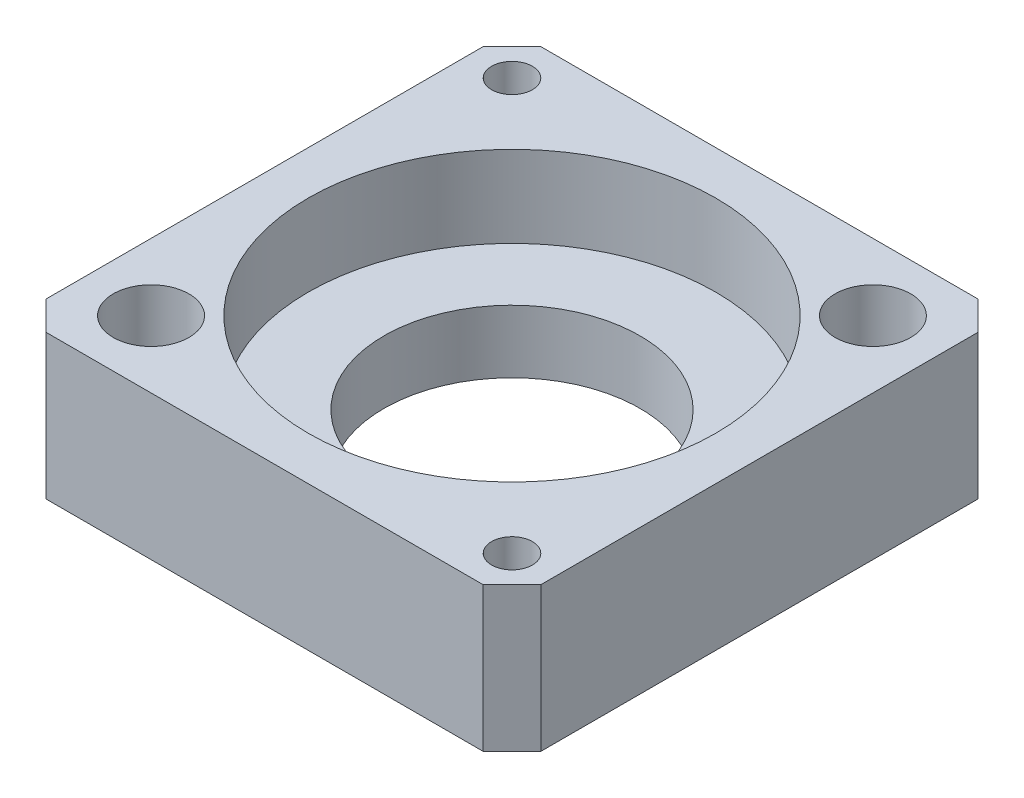
ISO-10303-21;
HEADER;
FILE_DESCRIPTION(('STEP AP214'),'2;1');
FILE_NAME('part.step','',(''),(''),'','','');
FILE_SCHEMA(('AUTOMOTIVE_DESIGN { 1 0 10303 214 1 1 1 1 }'));
ENDSEC;
DATA;
#1=APPLICATION_CONTEXT('core data for automotive mechanical design processes');
#2=APPLICATION_PROTOCOL_DEFINITION('international standard','automotive_design',2000,#1);
#3=PRODUCT_CONTEXT('',#1,'mechanical');
#4=PRODUCT('Part','Part','',(#3));
#5=PRODUCT_RELATED_PRODUCT_CATEGORY('part','',(#4));
#6=PRODUCT_DEFINITION_FORMATION('','',#4);
#7=PRODUCT_DEFINITION_CONTEXT('part definition',#1,'design');
#8=PRODUCT_DEFINITION('design','',#6,#7);
#9=PRODUCT_DEFINITION_SHAPE('','',#8);
#10=(LENGTH_UNIT() NAMED_UNIT(*) SI_UNIT(.MILLI.,.METRE.));
#11=(NAMED_UNIT(*) PLANE_ANGLE_UNIT() SI_UNIT($,.RADIAN.));
#12=(NAMED_UNIT(*) SI_UNIT($,.STERADIAN.) SOLID_ANGLE_UNIT());
#13=UNCERTAINTY_MEASURE_WITH_UNIT(LENGTH_MEASURE(1.E-05),#10,'distance_accuracy_value','');
#14=(GEOMETRIC_REPRESENTATION_CONTEXT(3) GLOBAL_UNCERTAINTY_ASSIGNED_CONTEXT((#13)) GLOBAL_UNIT_ASSIGNED_CONTEXT((#10,
#11,#12)) REPRESENTATION_CONTEXT('',''));
#15=CARTESIAN_POINT('',(0.,0.,0.));
#16=DIRECTION('',(0.,0.,1.));
#17=DIRECTION('',(1.,0.,0.));
#18=AXIS2_PLACEMENT_3D('',#15,#16,#17);
#19=CARTESIAN_POINT('',(0.,12.4,0.));
#20=DIRECTION('',(0.,0.,-1.));
#21=DIRECTION('',(-1.,0.,0.));
#22=AXIS2_PLACEMENT_3D('',#19,#20,#21);
#23=PLANE('',#22);
#24=DIRECTION('',(1.,0.,0.));
#25=VECTOR('',#24,1.);
#26=CARTESIAN_POINT('',(0.,0.,0.));
#27=LINE('',#26,#25);
#28=CARTESIAN_POINT('',(2.47487373415292,0.,0.));
#29=VERTEX_POINT('',#28);
#30=CARTESIAN_POINT('',(40.0251262658471,0.,0.));
#31=VERTEX_POINT('',#30);
#32=EDGE_CURVE('E139',#29,#31,#27,.T.);
#33=ORIENTED_EDGE('',*,*,#32,.T.);
#34=DIRECTION('',(0.,-1.,0.));
#35=VECTOR('',#34,1.);
#36=CARTESIAN_POINT('',(40.0251262658471,12.4,0.));
#37=LINE('',#36,#35);
#38=CARTESIAN_POINT('',(40.0251262658471,12.4,0.));
#39=VERTEX_POINT('',#38);
#40=EDGE_CURVE('E11',#39,#31,#37,.T.);
#41=ORIENTED_EDGE('',*,*,#40,.F.);
#42=DIRECTION('',(1.,0.,0.));
#43=VECTOR('',#42,1.);
#44=CARTESIAN_POINT('',(0.,12.4,0.));
#45=LINE('',#44,#43);
#46=CARTESIAN_POINT('',(2.47487373415292,12.4,0.));
#47=VERTEX_POINT('',#46);
#48=EDGE_CURVE('E157',#47,#39,#45,.T.);
#49=ORIENTED_EDGE('',*,*,#48,.F.);
#50=DIRECTION('',(0.,-1.,0.));
#51=VECTOR('',#50,1.);
#52=CARTESIAN_POINT('',(2.47487373415292,12.4,0.));
#53=LINE('',#52,#51);
#54=EDGE_CURVE('E135',#47,#29,#53,.T.);
#55=ORIENTED_EDGE('',*,*,#54,.T.);
#56=EDGE_LOOP('',(#33,#41,#49,#55));
#57=FACE_BOUND('',#56,.T.);
#58=ADVANCED_FACE('F43',(#57),#23,.F.);
#59=CARTESIAN_POINT('',(20.0125631329231,12.4,20.0125631329235));
#60=DIRECTION('',(-0.70710678118654,0.,-0.707106781186555));
#61=DIRECTION('',(-0.707106781186555,0.,0.70710678118654));
#62=AXIS2_PLACEMENT_3D('',#59,#60,#61);
#63=PLANE('',#62);
#64=DIRECTION('',(0.707106781186555,0.,-0.70710678118654));
#65=VECTOR('',#64,1.);
#66=CARTESIAN_POINT('',(20.0125631329231,0.,20.0125631329235));
#67=LINE('',#66,#65);
#68=CARTESIAN_POINT('',(42.5,0.,-2.47487373415289));
#69=VERTEX_POINT('',#68);
#70=EDGE_CURVE('E142',#31,#69,#67,.T.);
#71=ORIENTED_EDGE('',*,*,#70,.T.);
#72=DIRECTION('',(0.,-1.,0.));
#73=VECTOR('',#72,1.);
#74=CARTESIAN_POINT('',(42.5,12.4,-2.47487373415289));
#75=LINE('',#74,#73);
#76=CARTESIAN_POINT('',(42.5,12.4,-2.47487373415289));
#77=VERTEX_POINT('',#76);
#78=EDGE_CURVE('E52',#77,#69,#75,.T.);
#79=ORIENTED_EDGE('',*,*,#78,.F.);
#80=DIRECTION('',(0.707106781186555,0.,-0.70710678118654));
#81=VECTOR('',#80,1.);
#82=CARTESIAN_POINT('',(20.0125631329231,12.4,20.0125631329235));
#83=LINE('',#82,#81);
#84=EDGE_CURVE('E100',#39,#77,#83,.T.);
#85=ORIENTED_EDGE('',*,*,#84,.F.);
#86=ORIENTED_EDGE('',*,*,#40,.T.);
#87=EDGE_LOOP('',(#71,#79,#85,#86));
#88=FACE_BOUND('',#87,.T.);
#89=ADVANCED_FACE('F238',(#88),#63,.F.);
#90=CARTESIAN_POINT('',(42.5,12.4,0.));
#91=DIRECTION('',(-1.,0.,0.));
#92=DIRECTION('',(0.,0.,1.));
#93=AXIS2_PLACEMENT_3D('',#90,#91,#92);
#94=PLANE('',#93);
#95=DIRECTION('',(0.,0.,-1.));
#96=VECTOR('',#95,1.);
#97=CARTESIAN_POINT('',(42.5,0.,0.));
#98=LINE('',#97,#96);
#99=CARTESIAN_POINT('',(42.5,0.,-40.0251262658471));
#100=VERTEX_POINT('',#99);
#101=EDGE_CURVE('E145',#69,#100,#98,.T.);
#102=ORIENTED_EDGE('',*,*,#101,.T.);
#103=DIRECTION('',(0.,-1.,0.));
#104=VECTOR('',#103,1.);
#105=CARTESIAN_POINT('',(42.5,12.4,-40.0251262658471));
#106=LINE('',#105,#104);
#107=CARTESIAN_POINT('',(42.5,12.4,-40.0251262658471));
#108=VERTEX_POINT('',#107);
#109=EDGE_CURVE('E163',#108,#100,#106,.T.);
#110=ORIENTED_EDGE('',*,*,#109,.F.);
#111=DIRECTION('',(0.,0.,-1.));
#112=VECTOR('',#111,1.);
#113=CARTESIAN_POINT('',(42.5,12.4,0.));
#114=LINE('',#113,#112);
#115=EDGE_CURVE('E210',#77,#108,#114,.T.);
#116=ORIENTED_EDGE('',*,*,#115,.F.);
#117=ORIENTED_EDGE('',*,*,#78,.T.);
#118=EDGE_LOOP('',(#102,#110,#116,#117));
#119=FACE_BOUND('',#118,.T.);
#120=ADVANCED_FACE('F242',(#119),#94,.F.);
#121=CARTESIAN_POINT('',(41.2625631329238,12.4,-41.2625631329233));
#122=DIRECTION('',(-0.707106781186551,0.,0.707106781186544));
#123=DIRECTION('',(0.707106781186544,0.,0.707106781186551));
#124=AXIS2_PLACEMENT_3D('',#121,#122,#123);
#125=PLANE('',#124);
#126=DIRECTION('',(-0.707106781186544,0.,-0.707106781186551));
#127=VECTOR('',#126,1.);
#128=CARTESIAN_POINT('',(41.2625631329238,0.,-41.2625631329233));
#129=LINE('',#128,#127);
#130=CARTESIAN_POINT('',(40.0251262658471,0.,-42.5));
#131=VERTEX_POINT('',#130);
#132=EDGE_CURVE('E147',#100,#131,#129,.T.);
#133=ORIENTED_EDGE('',*,*,#132,.T.);
#134=DIRECTION('',(0.,-1.,0.));
#135=VECTOR('',#134,1.);
#136=CARTESIAN_POINT('',(40.0251262658471,12.4,-42.5));
#137=LINE('',#136,#135);
#138=CARTESIAN_POINT('',(40.0251262658471,12.4,-42.5));
#139=VERTEX_POINT('',#138);
#140=EDGE_CURVE('E161',#139,#131,#137,.T.);
#141=ORIENTED_EDGE('',*,*,#140,.F.);
#142=DIRECTION('',(-0.707106781186544,0.,-0.707106781186551));
#143=VECTOR('',#142,1.);
#144=CARTESIAN_POINT('',(41.2625631329238,12.4,-41.2625631329233));
#145=LINE('',#144,#143);
#146=EDGE_CURVE('E212',#108,#139,#145,.T.);
#147=ORIENTED_EDGE('',*,*,#146,.F.);
#148=ORIENTED_EDGE('',*,*,#109,.T.);
#149=EDGE_LOOP('',(#133,#141,#147,#148));
#150=FACE_BOUND('',#149,.T.);
#151=ADVANCED_FACE('F246',(#150),#125,.F.);
#152=CARTESIAN_POINT('',(0.,12.4,-42.5));
#153=DIRECTION('',(0.,0.,-1.));
#154=DIRECTION('',(-1.,0.,0.));
#155=AXIS2_PLACEMENT_3D('',#152,#153,#154);
#156=PLANE('',#155);
#157=DIRECTION('',(1.,0.,0.));
#158=VECTOR('',#157,1.);
#159=CARTESIAN_POINT('',(0.,0.,-42.5));
#160=LINE('',#159,#158);
#161=CARTESIAN_POINT('',(2.47487373415293,0.,-42.5));
#162=VERTEX_POINT('',#161);
#163=EDGE_CURVE('E150',#162,#131,#160,.T.);
#164=ORIENTED_EDGE('',*,*,#163,.F.);
#165=DIRECTION('',(0.,-1.,0.));
#166=VECTOR('',#165,1.);
#167=CARTESIAN_POINT('',(2.47487373415293,12.4,-42.5));
#168=LINE('',#167,#166);
#169=CARTESIAN_POINT('',(2.47487373415293,12.4,-42.5));
#170=VERTEX_POINT('',#169);
#171=EDGE_CURVE('E131',#170,#162,#168,.T.);
#172=ORIENTED_EDGE('',*,*,#171,.F.);
#173=DIRECTION('',(1.,0.,0.));
#174=VECTOR('',#173,1.);
#175=CARTESIAN_POINT('',(0.,12.4,-42.5));
#176=LINE('',#175,#174);
#177=EDGE_CURVE('E120',#170,#139,#176,.T.);
#178=ORIENTED_EDGE('',*,*,#177,.T.);
#179=ORIENTED_EDGE('',*,*,#140,.T.);
#180=EDGE_LOOP('',(#164,#172,#178,#179));
#181=FACE_BOUND('',#180,.T.);
#182=ADVANCED_FACE('F215',(#181),#156,.T.);
#183=CARTESIAN_POINT('',(-20.0125631329235,12.4,-20.0125631329237));
#184=DIRECTION('',(0.707106781186545,0.,0.70710678118655));
#185=DIRECTION('',(0.70710678118655,0.,-0.707106781186545));
#186=AXIS2_PLACEMENT_3D('',#183,#184,#185);
#187=PLANE('',#186);
#188=DIRECTION('',(-0.70710678118655,0.,0.707106781186545));
#189=VECTOR('',#188,1.);
#190=CARTESIAN_POINT('',(-20.0125631329235,0.,-20.0125631329237));
#191=LINE('',#190,#189);
#192=CARTESIAN_POINT('',(0.,0.,-40.0251262658471));
#193=VERTEX_POINT('',#192);
#194=EDGE_CURVE('E127',#162,#193,#191,.T.);
#195=ORIENTED_EDGE('',*,*,#194,.T.);
#196=DIRECTION('',(0.,-1.,0.));
#197=VECTOR('',#196,1.);
#198=CARTESIAN_POINT('',(0.,12.4,-40.0251262658471));
#199=LINE('',#198,#197);
#200=CARTESIAN_POINT('',(0.,12.4,-40.0251262658471));
#201=VERTEX_POINT('',#200);
#202=EDGE_CURVE('E124',#201,#193,#199,.T.);
#203=ORIENTED_EDGE('',*,*,#202,.F.);
#204=DIRECTION('',(-0.70710678118655,0.,0.707106781186545));
#205=VECTOR('',#204,1.);
#206=CARTESIAN_POINT('',(-20.0125631329235,12.4,-20.0125631329237));
#207=LINE('',#206,#205);
#208=EDGE_CURVE('E114',#170,#201,#207,.T.);
#209=ORIENTED_EDGE('',*,*,#208,.F.);
#210=ORIENTED_EDGE('',*,*,#171,.T.);
#211=EDGE_LOOP('',(#195,#203,#209,#210));
#212=FACE_BOUND('',#211,.T.);
#213=ADVANCED_FACE('F125',(#212),#187,.F.);
#214=CARTESIAN_POINT('',(0.,12.4,0.));
#215=DIRECTION('',(-1.,0.,0.));
#216=DIRECTION('',(0.,0.,1.));
#217=AXIS2_PLACEMENT_3D('',#214,#215,#216);
#218=PLANE('',#217);
#219=DIRECTION('',(0.,0.,-1.));
#220=VECTOR('',#219,1.);
#221=CARTESIAN_POINT('',(0.,0.,0.));
#222=LINE('',#221,#220);
#223=CARTESIAN_POINT('',(0.,0.,-2.47487373415292));
#224=VERTEX_POINT('',#223);
#225=EDGE_CURVE('E154',#224,#193,#222,.T.);
#226=ORIENTED_EDGE('',*,*,#225,.F.);
#227=DIRECTION('',(0.,-1.,0.));
#228=VECTOR('',#227,1.);
#229=CARTESIAN_POINT('',(0.,12.4,-2.47487373415292));
#230=LINE('',#229,#228);
#231=CARTESIAN_POINT('',(0.,12.4,-2.47487373415292));
#232=VERTEX_POINT('',#231);
#233=EDGE_CURVE('E89',#232,#224,#230,.T.);
#234=ORIENTED_EDGE('',*,*,#233,.F.);
#235=DIRECTION('',(0.,0.,-1.));
#236=VECTOR('',#235,1.);
#237=CARTESIAN_POINT('',(0.,12.4,0.));
#238=LINE('',#237,#236);
#239=EDGE_CURVE('E118',#232,#201,#238,.T.);
#240=ORIENTED_EDGE('',*,*,#239,.T.);
#241=ORIENTED_EDGE('',*,*,#202,.T.);
#242=EDGE_LOOP('',(#226,#234,#240,#241));
#243=FACE_BOUND('',#242,.T.);
#244=ADVANCED_FACE('F133',(#243),#218,.T.);
#245=CARTESIAN_POINT('',(1.23743686707646,12.4,-1.23743686707646));
#246=DIRECTION('',(0.707106781186548,0.,-0.707106781186547));
#247=DIRECTION('',(-0.707106781186547,0.,-0.707106781186548));
#248=AXIS2_PLACEMENT_3D('',#245,#246,#247);
#249=PLANE('',#248);
#250=DIRECTION('',(0.707106781186547,0.,0.707106781186548));
#251=VECTOR('',#250,1.);
#252=CARTESIAN_POINT('',(1.23743686707646,0.,-1.23743686707646));
#253=LINE('',#252,#251);
#254=EDGE_CURVE('E92',#224,#29,#253,.T.);
#255=ORIENTED_EDGE('',*,*,#254,.T.);
#256=ORIENTED_EDGE('',*,*,#54,.F.);
#257=DIRECTION('',(0.707106781186547,0.,0.707106781186548));
#258=VECTOR('',#257,1.);
#259=CARTESIAN_POINT('',(1.23743686707646,12.4,-1.23743686707646));
#260=LINE('',#259,#258);
#261=EDGE_CURVE('E61',#232,#47,#260,.T.);
#262=ORIENTED_EDGE('',*,*,#261,.F.);
#263=ORIENTED_EDGE('',*,*,#233,.T.);
#264=EDGE_LOOP('',(#255,#256,#262,#263));
#265=FACE_BOUND('',#264,.T.);
#266=ADVANCED_FACE('F225',(#265),#249,.F.);
#267=CARTESIAN_POINT('',(0.,12.4,0.));
#268=DIRECTION('',(0.,1.,0.));
#269=DIRECTION('',(0.,0.,1.));
#270=AXIS2_PLACEMENT_3D('',#267,#268,#269);
#271=PLANE('',#270);
#272=CARTESIAN_POINT('',(3.57233047033632,12.4,-38.9276695296637));
#273=DIRECTION('',(0.,1.,0.));
#274=DIRECTION('',(0.,0.,1.));
#275=AXIS2_PLACEMENT_3D('',#272,#273,#274);
#276=CIRCLE('',#275,1.75);
#277=CARTESIAN_POINT('',(3.57233047033632,12.4,-37.1776695296637));
#278=VERTEX_POINT('',#277);
#279=EDGE_CURVE('E184',#278,#278,#276,.T.);
#280=ORIENTED_EDGE('',*,*,#279,.F.);
#281=EDGE_LOOP('',(#280));
#282=FACE_BOUND('',#281,.T.);
#283=CARTESIAN_POINT('',(38.9276695296637,12.4,-3.57233047033631));
#284=DIRECTION('',(0.,1.,0.));
#285=DIRECTION('',(0.,0.,1.));
#286=AXIS2_PLACEMENT_3D('',#283,#284,#285);
#287=CIRCLE('',#286,1.75);
#288=CARTESIAN_POINT('',(38.9276695296637,12.4,-1.8223304703363));
#289=VERTEX_POINT('',#288);
#290=EDGE_CURVE('E180',#289,#289,#287,.T.);
#291=ORIENTED_EDGE('',*,*,#290,.F.);
#292=EDGE_LOOP('',(#291));
#293=FACE_BOUND('',#292,.T.);
#294=CARTESIAN_POINT('',(5.75000000000001,12.4,-5.75));
#295=DIRECTION('',(0.,1.,0.));
#296=DIRECTION('',(0.,0.,1.));
#297=AXIS2_PLACEMENT_3D('',#294,#295,#296);
#298=CIRCLE('',#297,3.25);
#299=CARTESIAN_POINT('',(5.75000000000001,12.4,-2.5));
#300=VERTEX_POINT('',#299);
#301=EDGE_CURVE('E190',#300,#300,#298,.T.);
#302=ORIENTED_EDGE('',*,*,#301,.F.);
#303=EDGE_LOOP('',(#302));
#304=FACE_BOUND('',#303,.T.);
#305=CARTESIAN_POINT('',(36.75,12.4,-36.75));
#306=DIRECTION('',(0.,1.,0.));
#307=DIRECTION('',(0.,0.,1.));
#308=AXIS2_PLACEMENT_3D('',#305,#306,#307);
#309=CIRCLE('',#308,3.25);
#310=CARTESIAN_POINT('',(36.75,12.4,-33.5));
#311=VERTEX_POINT('',#310);
#312=EDGE_CURVE('E173',#311,#311,#309,.T.);
#313=ORIENTED_EDGE('',*,*,#312,.F.);
#314=EDGE_LOOP('',(#313));
#315=FACE_BOUND('',#314,.T.);
#316=CARTESIAN_POINT('',(21.25,12.4,-21.25));
#317=DIRECTION('',(0.,1.,0.));
#318=DIRECTION('',(0.,0.,1.));
#319=AXIS2_PLACEMENT_3D('',#316,#317,#318);
#320=CIRCLE('',#319,17.5);
#321=CARTESIAN_POINT('',(21.25,12.4,-3.74999999999999));
#322=VERTEX_POINT('',#321);
#323=EDGE_CURVE('E201',#322,#322,#320,.T.);
#324=ORIENTED_EDGE('',*,*,#323,.F.);
#325=EDGE_LOOP('',(#324));
#326=FACE_BOUND('',#325,.T.);
#327=ORIENTED_EDGE('',*,*,#48,.T.);
#328=ORIENTED_EDGE('',*,*,#84,.T.);
#329=ORIENTED_EDGE('',*,*,#115,.T.);
#330=ORIENTED_EDGE('',*,*,#146,.T.);
#331=ORIENTED_EDGE('',*,*,#177,.F.);
#332=ORIENTED_EDGE('',*,*,#208,.T.);
#333=ORIENTED_EDGE('',*,*,#239,.F.);
#334=ORIENTED_EDGE('',*,*,#261,.T.);
#335=EDGE_LOOP('',(#327,#328,#329,#330,#331,#332,#333,#334));
#336=FACE_BOUND('',#335,.T.);
#337=ADVANCED_FACE('F116',(#282,#293,#304,#315,#326,#336),#271,.T.);
#338=CARTESIAN_POINT('',(0.,0.,0.));
#339=DIRECTION('',(0.,1.,0.));
#340=DIRECTION('',(0.,0.,1.));
#341=AXIS2_PLACEMENT_3D('',#338,#339,#340);
#342=PLANE('',#341);
#343=CARTESIAN_POINT('',(3.57233047033632,0.,-38.9276695296637));
#344=DIRECTION('',(0.,1.,0.));
#345=DIRECTION('',(0.,0.,1.));
#346=AXIS2_PLACEMENT_3D('',#343,#344,#345);
#347=CIRCLE('',#346,1.75);
#348=CARTESIAN_POINT('',(3.57233047033632,0.,-37.1776695296637));
#349=VERTEX_POINT('',#348);
#350=EDGE_CURVE('E398',#349,#349,#347,.T.);
#351=ORIENTED_EDGE('',*,*,#350,.T.);
#352=EDGE_LOOP('',(#351));
#353=FACE_BOUND('',#352,.T.);
#354=CARTESIAN_POINT('',(36.75,0.,-36.75));
#355=DIRECTION('',(0.,1.,0.));
#356=DIRECTION('',(0.,0.,1.));
#357=AXIS2_PLACEMENT_3D('',#354,#355,#356);
#358=CIRCLE('',#357,1.525);
#359=CARTESIAN_POINT('',(36.75,0.,-35.225));
#360=VERTEX_POINT('',#359);
#361=EDGE_CURVE('E401',#360,#360,#358,.T.);
#362=ORIENTED_EDGE('',*,*,#361,.T.);
#363=EDGE_LOOP('',(#362));
#364=FACE_BOUND('',#363,.T.);
#365=CARTESIAN_POINT('',(38.9276695296637,0.,-3.57233047033631));
#366=DIRECTION('',(0.,1.,0.));
#367=DIRECTION('',(0.,0.,1.));
#368=AXIS2_PLACEMENT_3D('',#365,#366,#367);
#369=CIRCLE('',#368,1.75);
#370=CARTESIAN_POINT('',(38.9276695296637,0.,-1.8223304703363));
#371=VERTEX_POINT('',#370);
#372=EDGE_CURVE('E175',#371,#371,#369,.T.);
#373=ORIENTED_EDGE('',*,*,#372,.T.);
#374=EDGE_LOOP('',(#373));
#375=FACE_BOUND('',#374,.T.);
#376=CARTESIAN_POINT('',(5.75000000000001,0.,-5.75));
#377=DIRECTION('',(0.,1.,0.));
#378=DIRECTION('',(0.,0.,1.));
#379=AXIS2_PLACEMENT_3D('',#376,#377,#378);
#380=CIRCLE('',#379,1.525);
#381=CARTESIAN_POINT('',(5.75000000000001,0.,-4.225));
#382=VERTEX_POINT('',#381);
#383=EDGE_CURVE('E169',#382,#382,#380,.T.);
#384=ORIENTED_EDGE('',*,*,#383,.T.);
#385=EDGE_LOOP('',(#384));
#386=FACE_BOUND('',#385,.T.);
#387=CARTESIAN_POINT('',(21.25,0.,-21.25));
#388=DIRECTION('',(0.,1.,0.));
#389=DIRECTION('',(0.,0.,1.));
#390=AXIS2_PLACEMENT_3D('',#387,#388,#389);
#391=CIRCLE('',#390,11.);
#392=CARTESIAN_POINT('',(21.25,0.,-10.25));
#393=VERTEX_POINT('',#392);
#394=EDGE_CURVE('E198',#393,#393,#391,.T.);
#395=ORIENTED_EDGE('',*,*,#394,.T.);
#396=EDGE_LOOP('',(#395));
#397=FACE_BOUND('',#396,.T.);
#398=ORIENTED_EDGE('',*,*,#32,.F.);
#399=ORIENTED_EDGE('',*,*,#254,.F.);
#400=ORIENTED_EDGE('',*,*,#225,.T.);
#401=ORIENTED_EDGE('',*,*,#194,.F.);
#402=ORIENTED_EDGE('',*,*,#163,.T.);
#403=ORIENTED_EDGE('',*,*,#132,.F.);
#404=ORIENTED_EDGE('',*,*,#101,.F.);
#405=ORIENTED_EDGE('',*,*,#70,.F.);
#406=EDGE_LOOP('',(#398,#399,#400,#401,#402,#403,#404,#405));
#407=FACE_BOUND('',#406,.T.);
#408=ADVANCED_FACE('F219',(#353,#364,#375,#386,#397,#407),#342,.F.);
#409=CARTESIAN_POINT('',(21.25,5.4,-21.25));
#410=DIRECTION('',(0.,1.,0.));
#411=DIRECTION('',(0.,0.,1.));
#412=AXIS2_PLACEMENT_3D('',#409,#410,#411);
#413=CYLINDRICAL_SURFACE('',#412,17.5);
#414=CARTESIAN_POINT('',(21.25,5.4,-21.25));
#415=DIRECTION('',(0.,1.,0.));
#416=DIRECTION('',(0.,0.,1.));
#417=AXIS2_PLACEMENT_3D('',#414,#415,#416);
#418=CIRCLE('',#417,17.5);
#419=CARTESIAN_POINT('',(21.25,5.4,-3.74999999999999));
#420=VERTEX_POINT('',#419);
#421=EDGE_CURVE('E143',#420,#420,#418,.T.);
#422=ORIENTED_EDGE('',*,*,#421,.F.);
#423=EDGE_LOOP('',(#422));
#424=FACE_BOUND('',#423,.T.);
#425=ORIENTED_EDGE('',*,*,#323,.T.);
#426=EDGE_LOOP('',(#425));
#427=FACE_BOUND('',#426,.T.);
#428=ADVANCED_FACE('F286',(#424,#427),#413,.F.);
#429=CARTESIAN_POINT('',(21.25,5.4,-21.25));
#430=DIRECTION('',(0.,1.,0.));
#431=DIRECTION('',(0.,0.,1.));
#432=AXIS2_PLACEMENT_3D('',#429,#430,#431);
#433=PLANE('',#432);
#434=CARTESIAN_POINT('',(21.25,5.4,-21.25));
#435=DIRECTION('',(0.,1.,0.));
#436=DIRECTION('',(0.,0.,1.));
#437=AXIS2_PLACEMENT_3D('',#434,#435,#436);
#438=CIRCLE('',#437,11.);
#439=CARTESIAN_POINT('',(21.25,5.4,-10.25));
#440=VERTEX_POINT('',#439);
#441=EDGE_CURVE('E189',#440,#440,#438,.T.);
#442=ORIENTED_EDGE('',*,*,#441,.F.);
#443=EDGE_LOOP('',(#442));
#444=FACE_BOUND('',#443,.T.);
#445=ORIENTED_EDGE('',*,*,#421,.T.);
#446=EDGE_LOOP('',(#445));
#447=FACE_BOUND('',#446,.T.);
#448=ADVANCED_FACE('F295',(#444,#447),#433,.T.);
#449=CARTESIAN_POINT('',(21.25,0.,-21.25));
#450=DIRECTION('',(0.,1.,0.));
#451=DIRECTION('',(0.,0.,1.));
#452=AXIS2_PLACEMENT_3D('',#449,#450,#451);
#453=CYLINDRICAL_SURFACE('',#452,11.);
#454=ORIENTED_EDGE('',*,*,#394,.F.);
#455=EDGE_LOOP('',(#454));
#456=FACE_BOUND('',#455,.T.);
#457=ORIENTED_EDGE('',*,*,#441,.T.);
#458=EDGE_LOOP('',(#457));
#459=FACE_BOUND('',#458,.T.);
#460=ADVANCED_FACE('F305',(#456,#459),#453,.F.);
#461=CARTESIAN_POINT('',(36.75,2.4,-36.75));
#462=DIRECTION('',(0.,1.,0.));
#463=DIRECTION('',(0.,0.,1.));
#464=AXIS2_PLACEMENT_3D('',#461,#462,#463);
#465=CYLINDRICAL_SURFACE('',#464,3.25);
#466=CARTESIAN_POINT('',(36.75,2.4,-36.75));
#467=DIRECTION('',(0.,1.,0.));
#468=DIRECTION('',(0.,0.,1.));
#469=AXIS2_PLACEMENT_3D('',#466,#467,#468);
#470=CIRCLE('',#469,3.25);
#471=CARTESIAN_POINT('',(36.75,2.4,-33.5));
#472=VERTEX_POINT('',#471);
#473=EDGE_CURVE('E193',#472,#472,#470,.T.);
#474=ORIENTED_EDGE('',*,*,#473,.F.);
#475=EDGE_LOOP('',(#474));
#476=FACE_BOUND('',#475,.T.);
#477=ORIENTED_EDGE('',*,*,#312,.T.);
#478=EDGE_LOOP('',(#477));
#479=FACE_BOUND('',#478,.T.);
#480=ADVANCED_FACE('F315',(#476,#479),#465,.F.);
#481=CARTESIAN_POINT('',(0.,2.4,0.));
#482=DIRECTION('',(0.,1.,0.));
#483=DIRECTION('',(0.,0.,1.));
#484=AXIS2_PLACEMENT_3D('',#481,#482,#483);
#485=PLANE('',#484);
#486=CARTESIAN_POINT('',(36.75,2.4,-36.75));
#487=DIRECTION('',(0.,1.,0.));
#488=DIRECTION('',(0.,0.,1.));
#489=AXIS2_PLACEMENT_3D('',#486,#487,#488);
#490=CIRCLE('',#489,1.525);
#491=CARTESIAN_POINT('',(36.75,2.4,-35.225));
#492=VERTEX_POINT('',#491);
#493=EDGE_CURVE('E46',#492,#492,#490,.T.);
#494=ORIENTED_EDGE('',*,*,#493,.F.);
#495=EDGE_LOOP('',(#494));
#496=FACE_BOUND('',#495,.T.);
#497=ORIENTED_EDGE('',*,*,#473,.T.);
#498=EDGE_LOOP('',(#497));
#499=FACE_BOUND('',#498,.T.);
#500=ADVANCED_FACE('F325',(#496,#499),#485,.T.);
#501=CARTESIAN_POINT('',(5.75000000000001,2.4,-5.75));
#502=DIRECTION('',(0.,1.,0.));
#503=DIRECTION('',(0.,0.,1.));
#504=AXIS2_PLACEMENT_3D('',#501,#502,#503);
#505=CYLINDRICAL_SURFACE('',#504,3.25);
#506=CARTESIAN_POINT('',(5.75000000000001,2.4,-5.75));
#507=DIRECTION('',(0.,1.,0.));
#508=DIRECTION('',(0.,0.,1.));
#509=AXIS2_PLACEMENT_3D('',#506,#507,#508);
#510=CIRCLE('',#509,3.25);
#511=CARTESIAN_POINT('',(5.75000000000001,2.4,-2.5));
#512=VERTEX_POINT('',#511);
#513=EDGE_CURVE('E186',#512,#512,#510,.T.);
#514=ORIENTED_EDGE('',*,*,#513,.F.);
#515=EDGE_LOOP('',(#514));
#516=FACE_BOUND('',#515,.T.);
#517=ORIENTED_EDGE('',*,*,#301,.T.);
#518=EDGE_LOOP('',(#517));
#519=FACE_BOUND('',#518,.T.);
#520=ADVANCED_FACE('F334',(#516,#519),#505,.F.);
#521=CARTESIAN_POINT('',(0.,2.4,0.));
#522=DIRECTION('',(0.,1.,0.));
#523=DIRECTION('',(0.,0.,1.));
#524=AXIS2_PLACEMENT_3D('',#521,#522,#523);
#525=PLANE('',#524);
#526=CARTESIAN_POINT('',(5.75000000000001,2.4,-5.75));
#527=DIRECTION('',(0.,1.,0.));
#528=DIRECTION('',(0.,0.,1.));
#529=AXIS2_PLACEMENT_3D('',#526,#527,#528);
#530=CIRCLE('',#529,1.525);
#531=CARTESIAN_POINT('',(5.75000000000001,2.4,-4.225));
#532=VERTEX_POINT('',#531);
#533=EDGE_CURVE('E167',#532,#532,#530,.T.);
#534=ORIENTED_EDGE('',*,*,#533,.F.);
#535=EDGE_LOOP('',(#534));
#536=FACE_BOUND('',#535,.T.);
#537=ORIENTED_EDGE('',*,*,#513,.T.);
#538=EDGE_LOOP('',(#537));
#539=FACE_BOUND('',#538,.T.);
#540=ADVANCED_FACE('F344',(#536,#539),#525,.T.);
#541=CARTESIAN_POINT('',(5.75000000000001,0.,-5.75));
#542=DIRECTION('',(0.,1.,0.));
#543=DIRECTION('',(0.,0.,1.));
#544=AXIS2_PLACEMENT_3D('',#541,#542,#543);
#545=CYLINDRICAL_SURFACE('',#544,1.525);
#546=CARTESIAN_POINT('',(5.75000000000001,2.4,-4.225));
#547=CARTESIAN_POINT('',(5.75000000000001,2.375,-4.225));
#548=CARTESIAN_POINT('',(5.75000000000001,2.35,-4.225));
#549=CARTESIAN_POINT('',(5.75000000000001,2.3,-4.225));
#550=CARTESIAN_POINT('',(5.75000000000001,2.275,-4.225));
#551=CARTESIAN_POINT('',(5.75000000000001,2.225,-4.225));
#552=CARTESIAN_POINT('',(5.75000000000001,2.2,-4.225));
#553=CARTESIAN_POINT('',(5.75000000000001,2.15,-4.225));
#554=CARTESIAN_POINT('',(5.75000000000001,2.125,-4.225));
#555=CARTESIAN_POINT('',(5.75000000000001,2.075,-4.225));
#556=CARTESIAN_POINT('',(5.75000000000001,2.05,-4.225));
#557=CARTESIAN_POINT('',(5.75000000000001,2.,-4.225));
#558=CARTESIAN_POINT('',(5.75000000000001,1.975,-4.225));
#559=CARTESIAN_POINT('',(5.75000000000001,1.925,-4.225));
#560=CARTESIAN_POINT('',(5.75000000000001,1.9,-4.225));
#561=CARTESIAN_POINT('',(5.75000000000001,1.85,-4.225));
#562=CARTESIAN_POINT('',(5.75000000000001,1.825,-4.225));
#563=CARTESIAN_POINT('',(5.75000000000001,1.775,-4.225));
#564=CARTESIAN_POINT('',(5.75000000000001,1.75,-4.225));
#565=CARTESIAN_POINT('',(5.75000000000001,1.7,-4.225));
#566=CARTESIAN_POINT('',(5.75000000000001,1.675,-4.225));
#567=CARTESIAN_POINT('',(5.75000000000001,1.625,-4.225));
#568=CARTESIAN_POINT('',(5.75000000000001,1.6,-4.225));
#569=CARTESIAN_POINT('',(5.75000000000001,1.55,-4.225));
#570=CARTESIAN_POINT('',(5.75000000000001,1.525,-4.225));
#571=CARTESIAN_POINT('',(5.75000000000001,1.475,-4.225));
#572=CARTESIAN_POINT('',(5.75000000000001,1.45,-4.225));
#573=CARTESIAN_POINT('',(5.75000000000001,1.4,-4.225));
#574=CARTESIAN_POINT('',(5.75000000000001,1.375,-4.225));
#575=CARTESIAN_POINT('',(5.75000000000001,1.325,-4.225));
#576=CARTESIAN_POINT('',(5.75000000000001,1.3,-4.225));
#577=CARTESIAN_POINT('',(5.75000000000001,1.25,-4.225));
#578=CARTESIAN_POINT('',(5.75000000000001,1.225,-4.225));
#579=CARTESIAN_POINT('',(5.75000000000001,1.175,-4.225));
#580=CARTESIAN_POINT('',(5.75000000000001,1.15,-4.225));
#581=CARTESIAN_POINT('',(5.75000000000001,1.1,-4.225));
#582=CARTESIAN_POINT('',(5.75000000000001,1.075,-4.225));
#583=CARTESIAN_POINT('',(5.75000000000001,1.025,-4.225));
#584=CARTESIAN_POINT('',(5.75000000000001,1.,-4.225));
#585=CARTESIAN_POINT('',(5.75000000000001,0.95,-4.225));
#586=CARTESIAN_POINT('',(5.75000000000001,0.925,-4.225));
#587=CARTESIAN_POINT('',(5.75000000000001,0.875,-4.225));
#588=CARTESIAN_POINT('',(5.75000000000001,0.85,-4.225));
#589=CARTESIAN_POINT('',(5.75000000000001,0.8,-4.225));
#590=CARTESIAN_POINT('',(5.75000000000001,0.775,-4.225));
#591=CARTESIAN_POINT('',(5.75000000000001,0.725,-4.225));
#592=CARTESIAN_POINT('',(5.75000000000001,0.7,-4.225));
#593=CARTESIAN_POINT('',(5.75000000000001,0.65,-4.225));
#594=CARTESIAN_POINT('',(5.75000000000001,0.625,-4.225));
#595=CARTESIAN_POINT('',(5.75000000000001,0.575,-4.225));
#596=CARTESIAN_POINT('',(5.75000000000001,0.55,-4.225));
#597=CARTESIAN_POINT('',(5.75000000000001,0.5,-4.225));
#598=CARTESIAN_POINT('',(5.75000000000001,0.475,-4.225));
#599=CARTESIAN_POINT('',(5.75000000000001,0.425,-4.225));
#600=CARTESIAN_POINT('',(5.75000000000001,0.4,-4.225));
#601=CARTESIAN_POINT('',(5.75000000000001,0.35,-4.225));
#602=CARTESIAN_POINT('',(5.75000000000001,0.325,-4.225));
#603=CARTESIAN_POINT('',(5.75000000000001,0.275,-4.225));
#604=CARTESIAN_POINT('',(5.75000000000001,0.25,-4.225));
#605=CARTESIAN_POINT('',(5.75000000000001,0.2,-4.225));
#606=CARTESIAN_POINT('',(5.75000000000001,0.175,-4.225));
#607=CARTESIAN_POINT('',(5.75000000000001,0.125,-4.225));
#608=CARTESIAN_POINT('',(5.75000000000001,0.1,-4.225));
#609=CARTESIAN_POINT('',(5.75000000000001,0.05,-4.225));
#610=CARTESIAN_POINT('',(5.75000000000001,0.025,-4.225));
#611=CARTESIAN_POINT('',(5.75000000000001,0.,-4.225));
#612=B_SPLINE_CURVE_WITH_KNOTS('',3,(#546,#547,#548,#549,#550,#551,#552,#553,#554,#555,#556,
#557,#558,#559,#560,#561,#562,#563,#564,#565,#566,#567,#568,#569,#570,#571,#572,#573,#574,#575,
#576,#577,#578,#579,#580,#581,#582,#583,#584,#585,#586,#587,#588,#589,#590,#591,#592,#593,#594,
#595,#596,#597,#598,#599,#600,#601,#602,#603,#604,#605,#606,#607,#608,#609,#610,#611),
.UNSPECIFIED.,.F.,.F.,(4,2,2,2,2,2,2,2,2,2,2,2,2,2,2,2,2,2,2,2,2,2,2,2,2,2,2,2,2,2,2,2,4),(0.,
0.075,0.15,0.225,0.3,0.375,0.45,0.525,0.6,0.675,0.75,0.825,0.9,0.975,1.05,1.125,1.2,1.275,1.35,
1.425,1.5,1.575,1.65,1.725,1.8,1.875,1.95,2.025,2.1,2.175,2.25,2.325,2.4),.UNSPECIFIED.);
#613=EDGE_CURVE('BSEAM353',#532,#382,#612,.T.);
#614=ORIENTED_EDGE('',*,*,#533,.T.);
#615=ORIENTED_EDGE('',*,*,#383,.F.);
#616=ORIENTED_EDGE('',*,*,#613,.T.);
#617=ORIENTED_EDGE('',*,*,#613,.F.);
#618=EDGE_LOOP('',(#614,#616,#615,#617));
#619=FACE_BOUND('',#618,.T.);
#620=ADVANCED_FACE('F353',(#619),#545,.F.);
#621=CARTESIAN_POINT('',(36.75,0.,-36.75));
#622=DIRECTION('',(0.,1.,0.));
#623=DIRECTION('',(0.,0.,1.));
#624=AXIS2_PLACEMENT_3D('',#621,#622,#623);
#625=CYLINDRICAL_SURFACE('',#624,1.525);
#626=CARTESIAN_POINT('',(36.75,2.4,-35.225));
#627=CARTESIAN_POINT('',(36.75,2.375,-35.225));
#628=CARTESIAN_POINT('',(36.75,2.35,-35.225));
#629=CARTESIAN_POINT('',(36.75,2.3,-35.225));
#630=CARTESIAN_POINT('',(36.75,2.275,-35.225));
#631=CARTESIAN_POINT('',(36.75,2.225,-35.225));
#632=CARTESIAN_POINT('',(36.75,2.2,-35.225));
#633=CARTESIAN_POINT('',(36.75,2.15,-35.225));
#634=CARTESIAN_POINT('',(36.75,2.125,-35.225));
#635=CARTESIAN_POINT('',(36.75,2.075,-35.225));
#636=CARTESIAN_POINT('',(36.75,2.05,-35.225));
#637=CARTESIAN_POINT('',(36.75,2.,-35.225));
#638=CARTESIAN_POINT('',(36.75,1.975,-35.225));
#639=CARTESIAN_POINT('',(36.75,1.925,-35.225));
#640=CARTESIAN_POINT('',(36.75,1.9,-35.225));
#641=CARTESIAN_POINT('',(36.75,1.85,-35.225));
#642=CARTESIAN_POINT('',(36.75,1.825,-35.225));
#643=CARTESIAN_POINT('',(36.75,1.775,-35.225));
#644=CARTESIAN_POINT('',(36.75,1.75,-35.225));
#645=CARTESIAN_POINT('',(36.75,1.7,-35.225));
#646=CARTESIAN_POINT('',(36.75,1.675,-35.225));
#647=CARTESIAN_POINT('',(36.75,1.625,-35.225));
#648=CARTESIAN_POINT('',(36.75,1.6,-35.225));
#649=CARTESIAN_POINT('',(36.75,1.55,-35.225));
#650=CARTESIAN_POINT('',(36.75,1.525,-35.225));
#651=CARTESIAN_POINT('',(36.75,1.475,-35.225));
#652=CARTESIAN_POINT('',(36.75,1.45,-35.225));
#653=CARTESIAN_POINT('',(36.75,1.4,-35.225));
#654=CARTESIAN_POINT('',(36.75,1.375,-35.225));
#655=CARTESIAN_POINT('',(36.75,1.325,-35.225));
#656=CARTESIAN_POINT('',(36.75,1.3,-35.225));
#657=CARTESIAN_POINT('',(36.75,1.25,-35.225));
#658=CARTESIAN_POINT('',(36.75,1.225,-35.225));
#659=CARTESIAN_POINT('',(36.75,1.175,-35.225));
#660=CARTESIAN_POINT('',(36.75,1.15,-35.225));
#661=CARTESIAN_POINT('',(36.75,1.1,-35.225));
#662=CARTESIAN_POINT('',(36.75,1.075,-35.225));
#663=CARTESIAN_POINT('',(36.75,1.025,-35.225));
#664=CARTESIAN_POINT('',(36.75,1.,-35.225));
#665=CARTESIAN_POINT('',(36.75,0.95,-35.225));
#666=CARTESIAN_POINT('',(36.75,0.925,-35.225));
#667=CARTESIAN_POINT('',(36.75,0.875,-35.225));
#668=CARTESIAN_POINT('',(36.75,0.85,-35.225));
#669=CARTESIAN_POINT('',(36.75,0.8,-35.225));
#670=CARTESIAN_POINT('',(36.75,0.775,-35.225));
#671=CARTESIAN_POINT('',(36.75,0.725,-35.225));
#672=CARTESIAN_POINT('',(36.75,0.7,-35.225));
#673=CARTESIAN_POINT('',(36.75,0.65,-35.225));
#674=CARTESIAN_POINT('',(36.75,0.625,-35.225));
#675=CARTESIAN_POINT('',(36.75,0.575,-35.225));
#676=CARTESIAN_POINT('',(36.75,0.55,-35.225));
#677=CARTESIAN_POINT('',(36.75,0.5,-35.225));
#678=CARTESIAN_POINT('',(36.75,0.475,-35.225));
#679=CARTESIAN_POINT('',(36.75,0.425,-35.225));
#680=CARTESIAN_POINT('',(36.75,0.4,-35.225));
#681=CARTESIAN_POINT('',(36.75,0.35,-35.225));
#682=CARTESIAN_POINT('',(36.75,0.325,-35.225));
#683=CARTESIAN_POINT('',(36.75,0.275,-35.225));
#684=CARTESIAN_POINT('',(36.75,0.25,-35.225));
#685=CARTESIAN_POINT('',(36.75,0.2,-35.225));
#686=CARTESIAN_POINT('',(36.75,0.175,-35.225));
#687=CARTESIAN_POINT('',(36.75,0.125,-35.225));
#688=CARTESIAN_POINT('',(36.75,0.1,-35.225));
#689=CARTESIAN_POINT('',(36.75,0.05,-35.225));
#690=CARTESIAN_POINT('',(36.75,0.025,-35.225));
#691=CARTESIAN_POINT('',(36.75,0.,-35.225));
#692=B_SPLINE_CURVE_WITH_KNOTS('',3,(#626,#627,#628,#629,#630,#631,#632,#633,#634,#635,#636,
#637,#638,#639,#640,#641,#642,#643,#644,#645,#646,#647,#648,#649,#650,#651,#652,#653,#654,#655,
#656,#657,#658,#659,#660,#661,#662,#663,#664,#665,#666,#667,#668,#669,#670,#671,#672,#673,#674,
#675,#676,#677,#678,#679,#680,#681,#682,#683,#684,#685,#686,#687,#688,#689,#690,#691),
.UNSPECIFIED.,.F.,.F.,(4,2,2,2,2,2,2,2,2,2,2,2,2,2,2,2,2,2,2,2,2,2,2,2,2,2,2,2,2,2,2,2,4),(0.,
0.075,0.15,0.225,0.3,0.375,0.45,0.525,0.6,0.675,0.75,0.825,0.9,0.975,1.05,1.125,1.2,1.275,1.35,
1.425,1.5,1.575,1.65,1.725,1.8,1.875,1.95,2.025,2.1,2.175,2.25,2.325,2.4),.UNSPECIFIED.);
#693=EDGE_CURVE('BSEAM363',#492,#360,#692,.T.);
#694=ORIENTED_EDGE('',*,*,#493,.T.);
#695=ORIENTED_EDGE('',*,*,#361,.F.);
#696=ORIENTED_EDGE('',*,*,#693,.T.);
#697=ORIENTED_EDGE('',*,*,#693,.F.);
#698=EDGE_LOOP('',(#694,#696,#695,#697));
#699=FACE_BOUND('',#698,.T.);
#700=ADVANCED_FACE('F363',(#699),#625,.F.);
#701=CARTESIAN_POINT('',(38.9276695296637,0.,-3.57233047033631));
#702=DIRECTION('',(0.,1.,0.));
#703=DIRECTION('',(0.,0.,1.));
#704=AXIS2_PLACEMENT_3D('',#701,#702,#703);
#705=CYLINDRICAL_SURFACE('',#704,1.75);
#706=CARTESIAN_POINT('',(38.9276695296637,0.,-1.8223304703363));
#707=CARTESIAN_POINT('',(38.9276695296637,0.129166666666667,-1.8223304703363));
#708=CARTESIAN_POINT('',(38.9276695296637,0.258333333333333,-1.8223304703363));
#709=CARTESIAN_POINT('',(38.9276695296637,0.516666666666667,-1.8223304703363));
#710=CARTESIAN_POINT('',(38.9276695296637,0.645833333333333,-1.8223304703363));
#711=CARTESIAN_POINT('',(38.9276695296637,0.904166666666667,-1.8223304703363));
#712=CARTESIAN_POINT('',(38.9276695296637,1.03333333333333,-1.8223304703363));
#713=CARTESIAN_POINT('',(38.9276695296637,1.29166666666667,-1.8223304703363));
#714=CARTESIAN_POINT('',(38.9276695296637,1.42083333333333,-1.8223304703363));
#715=CARTESIAN_POINT('',(38.9276695296637,1.67916666666667,-1.8223304703363));
#716=CARTESIAN_POINT('',(38.9276695296637,1.80833333333333,-1.8223304703363));
#717=CARTESIAN_POINT('',(38.9276695296637,2.06666666666667,-1.8223304703363));
#718=CARTESIAN_POINT('',(38.9276695296637,2.19583333333333,-1.8223304703363));
#719=CARTESIAN_POINT('',(38.9276695296637,2.45416666666667,-1.8223304703363));
#720=CARTESIAN_POINT('',(38.9276695296637,2.58333333333333,-1.8223304703363));
#721=CARTESIAN_POINT('',(38.9276695296637,2.84166666666667,-1.8223304703363));
#722=CARTESIAN_POINT('',(38.9276695296637,2.97083333333333,-1.8223304703363));
#723=CARTESIAN_POINT('',(38.9276695296637,3.22916666666667,-1.8223304703363));
#724=CARTESIAN_POINT('',(38.9276695296637,3.35833333333333,-1.8223304703363));
#725=CARTESIAN_POINT('',(38.9276695296637,3.61666666666667,-1.8223304703363));
#726=CARTESIAN_POINT('',(38.9276695296637,3.74583333333333,-1.8223304703363));
#727=CARTESIAN_POINT('',(38.9276695296637,4.00416666666667,-1.8223304703363));
#728=CARTESIAN_POINT('',(38.9276695296637,4.13333333333333,-1.8223304703363));
#729=CARTESIAN_POINT('',(38.9276695296637,4.39166666666667,-1.8223304703363));
#730=CARTESIAN_POINT('',(38.9276695296637,4.52083333333333,-1.8223304703363));
#731=CARTESIAN_POINT('',(38.9276695296637,4.77916666666667,-1.8223304703363));
#732=CARTESIAN_POINT('',(38.9276695296637,4.90833333333333,-1.8223304703363));
#733=CARTESIAN_POINT('',(38.9276695296637,5.16666666666667,-1.8223304703363));
#734=CARTESIAN_POINT('',(38.9276695296637,5.29583333333333,-1.8223304703363));
#735=CARTESIAN_POINT('',(38.9276695296637,5.55416666666667,-1.8223304703363));
#736=CARTESIAN_POINT('',(38.9276695296637,5.68333333333333,-1.8223304703363));
#737=CARTESIAN_POINT('',(38.9276695296637,5.94166666666667,-1.8223304703363));
#738=CARTESIAN_POINT('',(38.9276695296637,6.07083333333333,-1.8223304703363));
#739=CARTESIAN_POINT('',(38.9276695296637,6.32916666666667,-1.8223304703363));
#740=CARTESIAN_POINT('',(38.9276695296637,6.45833333333333,-1.8223304703363));
#741=CARTESIAN_POINT('',(38.9276695296637,6.71666666666667,-1.8223304703363));
#742=CARTESIAN_POINT('',(38.9276695296637,6.84583333333333,-1.8223304703363));
#743=CARTESIAN_POINT('',(38.9276695296637,7.10416666666667,-1.8223304703363));
#744=CARTESIAN_POINT('',(38.9276695296637,7.23333333333333,-1.8223304703363));
#745=CARTESIAN_POINT('',(38.9276695296637,7.49166666666667,-1.8223304703363));
#746=CARTESIAN_POINT('',(38.9276695296637,7.62083333333333,-1.8223304703363));
#747=CARTESIAN_POINT('',(38.9276695296637,7.87916666666667,-1.8223304703363));
#748=CARTESIAN_POINT('',(38.9276695296637,8.00833333333333,-1.8223304703363));
#749=CARTESIAN_POINT('',(38.9276695296637,8.26666666666667,-1.8223304703363));
#750=CARTESIAN_POINT('',(38.9276695296637,8.39583333333333,-1.8223304703363));
#751=CARTESIAN_POINT('',(38.9276695296637,8.65416666666667,-1.8223304703363));
#752=CARTESIAN_POINT('',(38.9276695296637,8.78333333333333,-1.8223304703363));
#753=CARTESIAN_POINT('',(38.9276695296637,9.04166666666666,-1.8223304703363));
#754=CARTESIAN_POINT('',(38.9276695296637,9.17083333333333,-1.8223304703363));
#755=CARTESIAN_POINT('',(38.9276695296637,9.42916666666667,-1.8223304703363));
#756=CARTESIAN_POINT('',(38.9276695296637,9.55833333333333,-1.8223304703363));
#757=CARTESIAN_POINT('',(38.9276695296637,9.81666666666667,-1.8223304703363));
#758=CARTESIAN_POINT('',(38.9276695296637,9.94583333333333,-1.8223304703363));
#759=CARTESIAN_POINT('',(38.9276695296637,10.2041666666667,-1.8223304703363));
#760=CARTESIAN_POINT('',(38.9276695296637,10.3333333333333,-1.8223304703363));
#761=CARTESIAN_POINT('',(38.9276695296637,10.5916666666667,-1.8223304703363));
#762=CARTESIAN_POINT('',(38.9276695296637,10.7208333333333,-1.8223304703363));
#763=CARTESIAN_POINT('',(38.9276695296637,10.9791666666667,-1.8223304703363));
#764=CARTESIAN_POINT('',(38.9276695296637,11.1083333333333,-1.8223304703363));
#765=CARTESIAN_POINT('',(38.9276695296637,11.3666666666667,-1.8223304703363));
#766=CARTESIAN_POINT('',(38.9276695296637,11.4958333333333,-1.8223304703363));
#767=CARTESIAN_POINT('',(38.9276695296637,11.7541666666667,-1.8223304703363));
#768=CARTESIAN_POINT('',(38.9276695296637,11.8833333333333,-1.8223304703363));
#769=CARTESIAN_POINT('',(38.9276695296637,12.1416666666667,-1.8223304703363));
#770=CARTESIAN_POINT('',(38.9276695296637,12.2708333333333,-1.8223304703363));
#771=CARTESIAN_POINT('',(38.9276695296637,12.4,-1.8223304703363));
#772=B_SPLINE_CURVE_WITH_KNOTS('',3,(#706,#707,#708,#709,#710,#711,#712,#713,#714,#715,#716,
#717,#718,#719,#720,#721,#722,#723,#724,#725,#726,#727,#728,#729,#730,#731,#732,#733,#734,#735,
#736,#737,#738,#739,#740,#741,#742,#743,#744,#745,#746,#747,#748,#749,#750,#751,#752,#753,#754,
#755,#756,#757,#758,#759,#760,#761,#762,#763,#764,#765,#766,#767,#768,#769,#770,#771),
.UNSPECIFIED.,.F.,.F.,(4,2,2,2,2,2,2,2,2,2,2,2,2,2,2,2,2,2,2,2,2,2,2,2,2,2,2,2,2,2,2,2,4),(0.,
0.3875,0.775,1.1625,1.55,1.9375,2.325,2.7125,3.1,3.4875,3.875,4.2625,4.65,5.0375,5.425,5.8125,
6.2,6.5875,6.975,7.3625,7.75,8.1375,8.525,8.9125,9.3,9.6875,10.075,10.4625,10.85,11.2375,11.625,
12.0125,12.4),.UNSPECIFIED.);
#773=EDGE_CURVE('BSEAM372',#371,#289,#772,.T.);
#774=ORIENTED_EDGE('',*,*,#372,.F.);
#775=ORIENTED_EDGE('',*,*,#290,.T.);
#776=ORIENTED_EDGE('',*,*,#773,.T.);
#777=ORIENTED_EDGE('',*,*,#773,.F.);
#778=EDGE_LOOP('',(#774,#776,#775,#777));
#779=FACE_BOUND('',#778,.T.);
#780=ADVANCED_FACE('F372',(#779),#705,.F.);
#781=CARTESIAN_POINT('',(3.57233047033632,0.,-38.9276695296637));
#782=DIRECTION('',(0.,1.,0.));
#783=DIRECTION('',(0.,0.,1.));
#784=AXIS2_PLACEMENT_3D('',#781,#782,#783);
#785=CYLINDRICAL_SURFACE('',#784,1.75);
#786=CARTESIAN_POINT('',(3.57233047033632,0.,-37.1776695296637));
#787=CARTESIAN_POINT('',(3.57233047033632,0.129166666666667,-37.1776695296637));
#788=CARTESIAN_POINT('',(3.57233047033632,0.258333333333333,-37.1776695296637));
#789=CARTESIAN_POINT('',(3.57233047033632,0.516666666666667,-37.1776695296637));
#790=CARTESIAN_POINT('',(3.57233047033632,0.645833333333333,-37.1776695296637));
#791=CARTESIAN_POINT('',(3.57233047033632,0.904166666666667,-37.1776695296637));
#792=CARTESIAN_POINT('',(3.57233047033632,1.03333333333333,-37.1776695296637));
#793=CARTESIAN_POINT('',(3.57233047033632,1.29166666666667,-37.1776695296637));
#794=CARTESIAN_POINT('',(3.57233047033632,1.42083333333333,-37.1776695296637));
#795=CARTESIAN_POINT('',(3.57233047033632,1.67916666666667,-37.1776695296637));
#796=CARTESIAN_POINT('',(3.57233047033632,1.80833333333333,-37.1776695296637));
#797=CARTESIAN_POINT('',(3.57233047033632,2.06666666666667,-37.1776695296637));
#798=CARTESIAN_POINT('',(3.57233047033632,2.19583333333333,-37.1776695296637));
#799=CARTESIAN_POINT('',(3.57233047033632,2.45416666666667,-37.1776695296637));
#800=CARTESIAN_POINT('',(3.57233047033632,2.58333333333333,-37.1776695296637));
#801=CARTESIAN_POINT('',(3.57233047033632,2.84166666666667,-37.1776695296637));
#802=CARTESIAN_POINT('',(3.57233047033632,2.97083333333333,-37.1776695296637));
#803=CARTESIAN_POINT('',(3.57233047033632,3.22916666666667,-37.1776695296637));
#804=CARTESIAN_POINT('',(3.57233047033632,3.35833333333333,-37.1776695296637));
#805=CARTESIAN_POINT('',(3.57233047033632,3.61666666666667,-37.1776695296637));
#806=CARTESIAN_POINT('',(3.57233047033632,3.74583333333333,-37.1776695296637));
#807=CARTESIAN_POINT('',(3.57233047033632,4.00416666666667,-37.1776695296637));
#808=CARTESIAN_POINT('',(3.57233047033632,4.13333333333333,-37.1776695296637));
#809=CARTESIAN_POINT('',(3.57233047033632,4.39166666666667,-37.1776695296637));
#810=CARTESIAN_POINT('',(3.57233047033632,4.52083333333333,-37.1776695296637));
#811=CARTESIAN_POINT('',(3.57233047033632,4.77916666666667,-37.1776695296637));
#812=CARTESIAN_POINT('',(3.57233047033632,4.90833333333333,-37.1776695296637));
#813=CARTESIAN_POINT('',(3.57233047033632,5.16666666666667,-37.1776695296637));
#814=CARTESIAN_POINT('',(3.57233047033632,5.29583333333333,-37.1776695296637));
#815=CARTESIAN_POINT('',(3.57233047033632,5.55416666666667,-37.1776695296637));
#816=CARTESIAN_POINT('',(3.57233047033632,5.68333333333333,-37.1776695296637));
#817=CARTESIAN_POINT('',(3.57233047033632,5.94166666666667,-37.1776695296637));
#818=CARTESIAN_POINT('',(3.57233047033632,6.07083333333333,-37.1776695296637));
#819=CARTESIAN_POINT('',(3.57233047033632,6.32916666666667,-37.1776695296637));
#820=CARTESIAN_POINT('',(3.57233047033632,6.45833333333333,-37.1776695296637));
#821=CARTESIAN_POINT('',(3.57233047033632,6.71666666666667,-37.1776695296637));
#822=CARTESIAN_POINT('',(3.57233047033632,6.84583333333333,-37.1776695296637));
#823=CARTESIAN_POINT('',(3.57233047033632,7.10416666666667,-37.1776695296637));
#824=CARTESIAN_POINT('',(3.57233047033632,7.23333333333333,-37.1776695296637));
#825=CARTESIAN_POINT('',(3.57233047033632,7.49166666666667,-37.1776695296637));
#826=CARTESIAN_POINT('',(3.57233047033632,7.62083333333333,-37.1776695296637));
#827=CARTESIAN_POINT('',(3.57233047033632,7.87916666666667,-37.1776695296637));
#828=CARTESIAN_POINT('',(3.57233047033632,8.00833333333333,-37.1776695296637));
#829=CARTESIAN_POINT('',(3.57233047033632,8.26666666666667,-37.1776695296637));
#830=CARTESIAN_POINT('',(3.57233047033632,8.39583333333333,-37.1776695296637));
#831=CARTESIAN_POINT('',(3.57233047033632,8.65416666666667,-37.1776695296637));
#832=CARTESIAN_POINT('',(3.57233047033632,8.78333333333333,-37.1776695296637));
#833=CARTESIAN_POINT('',(3.57233047033632,9.04166666666666,-37.1776695296637));
#834=CARTESIAN_POINT('',(3.57233047033632,9.17083333333333,-37.1776695296637));
#835=CARTESIAN_POINT('',(3.57233047033632,9.42916666666667,-37.1776695296637));
#836=CARTESIAN_POINT('',(3.57233047033632,9.55833333333333,-37.1776695296637));
#837=CARTESIAN_POINT('',(3.57233047033632,9.81666666666667,-37.1776695296637));
#838=CARTESIAN_POINT('',(3.57233047033632,9.94583333333333,-37.1776695296637));
#839=CARTESIAN_POINT('',(3.57233047033632,10.2041666666667,-37.1776695296637));
#840=CARTESIAN_POINT('',(3.57233047033632,10.3333333333333,-37.1776695296637));
#841=CARTESIAN_POINT('',(3.57233047033632,10.5916666666667,-37.1776695296637));
#842=CARTESIAN_POINT('',(3.57233047033632,10.7208333333333,-37.1776695296637));
#843=CARTESIAN_POINT('',(3.57233047033632,10.9791666666667,-37.1776695296637));
#844=CARTESIAN_POINT('',(3.57233047033632,11.1083333333333,-37.1776695296637));
#845=CARTESIAN_POINT('',(3.57233047033632,11.3666666666667,-37.1776695296637));
#846=CARTESIAN_POINT('',(3.57233047033632,11.4958333333333,-37.1776695296637));
#847=CARTESIAN_POINT('',(3.57233047033632,11.7541666666667,-37.1776695296637));
#848=CARTESIAN_POINT('',(3.57233047033632,11.8833333333333,-37.1776695296637));
#849=CARTESIAN_POINT('',(3.57233047033632,12.1416666666667,-37.1776695296637));
#850=CARTESIAN_POINT('',(3.57233047033632,12.2708333333333,-37.1776695296637));
#851=CARTESIAN_POINT('',(3.57233047033632,12.4,-37.1776695296637));
#852=B_SPLINE_CURVE_WITH_KNOTS('',3,(#786,#787,#788,#789,#790,#791,#792,#793,#794,#795,#796,
#797,#798,#799,#800,#801,#802,#803,#804,#805,#806,#807,#808,#809,#810,#811,#812,#813,#814,#815,
#816,#817,#818,#819,#820,#821,#822,#823,#824,#825,#826,#827,#828,#829,#830,#831,#832,#833,#834,
#835,#836,#837,#838,#839,#840,#841,#842,#843,#844,#845,#846,#847,#848,#849,#850,#851),
.UNSPECIFIED.,.F.,.F.,(4,2,2,2,2,2,2,2,2,2,2,2,2,2,2,2,2,2,2,2,2,2,2,2,2,2,2,2,2,2,2,2,4),(0.,
0.3875,0.775,1.1625,1.55,1.9375,2.325,2.7125,3.1,3.4875,3.875,4.2625,4.65,5.0375,5.425,5.8125,
6.2,6.5875,6.975,7.3625,7.75,8.1375,8.525,8.9125,9.3,9.6875,10.075,10.4625,10.85,11.2375,11.625,
12.0125,12.4),.UNSPECIFIED.);
#853=EDGE_CURVE('BSEAM382',#349,#278,#852,.T.);
#854=ORIENTED_EDGE('',*,*,#350,.F.);
#855=ORIENTED_EDGE('',*,*,#279,.T.);
#856=ORIENTED_EDGE('',*,*,#853,.T.);
#857=ORIENTED_EDGE('',*,*,#853,.F.);
#858=EDGE_LOOP('',(#854,#856,#855,#857));
#859=FACE_BOUND('',#858,.T.);
#860=ADVANCED_FACE('F382',(#859),#785,.F.);
#861=CLOSED_SHELL('',(#58,#89,#120,#151,#182,#213,#244,#266,#337,#408,#428,#448,#460,#480,#500,
#520,#540,#620,#700,#780,#860));
#862=MANIFOLD_SOLID_BREP('B2',#861);
#863=ADVANCED_BREP_SHAPE_REPRESENTATION('',(#18,#862),#14);
#864=SHAPE_DEFINITION_REPRESENTATION(#9,#863);
ENDSEC;
END-ISO-10303-21;
